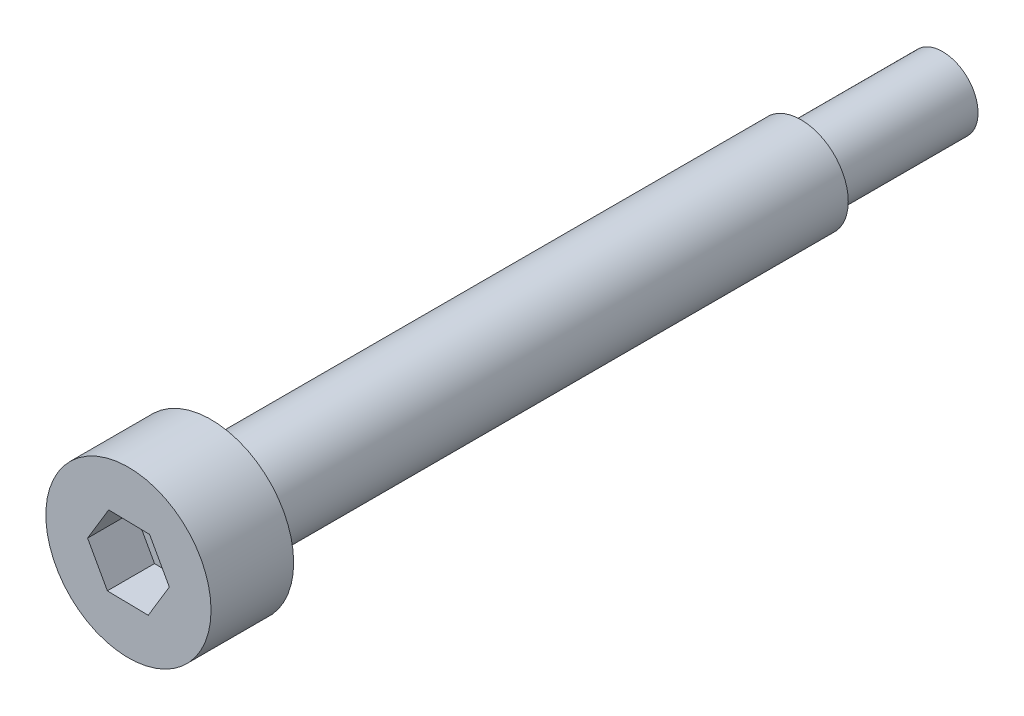
ISO-10303-21;
HEADER;
FILE_DESCRIPTION(('STEP AP214'),'2;1');
FILE_NAME('part.step','',(''),(''),'','','');
FILE_SCHEMA(('AUTOMOTIVE_DESIGN { 1 0 10303 214 1 1 1 1 }'));
ENDSEC;
DATA;
#1=APPLICATION_CONTEXT('core data for automotive mechanical design processes');
#2=APPLICATION_PROTOCOL_DEFINITION('international standard','automotive_design',2000,#1);
#3=PRODUCT_CONTEXT('',#1,'mechanical');
#4=PRODUCT('Part','Part','',(#3));
#5=PRODUCT_RELATED_PRODUCT_CATEGORY('part','',(#4));
#6=PRODUCT_DEFINITION_FORMATION('','',#4);
#7=PRODUCT_DEFINITION_CONTEXT('part definition',#1,'design');
#8=PRODUCT_DEFINITION('design','',#6,#7);
#9=PRODUCT_DEFINITION_SHAPE('','',#8);
#10=(LENGTH_UNIT() NAMED_UNIT(*) SI_UNIT(.MILLI.,.METRE.));
#11=(NAMED_UNIT(*) PLANE_ANGLE_UNIT() SI_UNIT($,.RADIAN.));
#12=(NAMED_UNIT(*) SI_UNIT($,.STERADIAN.) SOLID_ANGLE_UNIT());
#13=UNCERTAINTY_MEASURE_WITH_UNIT(LENGTH_MEASURE(1.E-05),#10,'distance_accuracy_value','');
#14=(GEOMETRIC_REPRESENTATION_CONTEXT(3) GLOBAL_UNCERTAINTY_ASSIGNED_CONTEXT((#13)) GLOBAL_UNIT_ASSIGNED_CONTEXT((#10,
#11,#12)) REPRESENTATION_CONTEXT('',''));
#15=CARTESIAN_POINT('',(0.,0.,0.));
#16=DIRECTION('',(0.,0.,1.));
#17=DIRECTION('',(1.,0.,0.));
#18=AXIS2_PLACEMENT_3D('',#15,#16,#17);
#19=CARTESIAN_POINT('',(0.,0.,3.5));
#20=DIRECTION('',(0.,0.,-1.));
#21=DIRECTION('',(-1.,0.,0.));
#22=AXIS2_PLACEMENT_3D('',#19,#20,#21);
#23=CYLINDRICAL_SURFACE('',#22,3.5);
#24=CARTESIAN_POINT('',(0.,0.,3.5));
#25=DIRECTION('',(0.,0.,1.));
#26=DIRECTION('',(1.,0.,0.));
#27=AXIS2_PLACEMENT_3D('',#24,#25,#26);
#28=CIRCLE('',#27,3.5);
#29=CARTESIAN_POINT('',(3.5,0.,3.5));
#30=VERTEX_POINT('',#29);
#31=EDGE_CURVE('E44',#30,#30,#28,.T.);
#32=ORIENTED_EDGE('',*,*,#31,.F.);
#33=EDGE_LOOP('',(#32));
#34=FACE_BOUND('',#33,.T.);
#35=CARTESIAN_POINT('',(0.,0.,0.));
#36=DIRECTION('',(0.,0.,1.));
#37=DIRECTION('',(1.,0.,0.));
#38=AXIS2_PLACEMENT_3D('',#35,#36,#37);
#39=CIRCLE('',#38,3.5);
#40=CARTESIAN_POINT('',(3.5,0.,0.));
#41=VERTEX_POINT('',#40);
#42=EDGE_CURVE('E139',#41,#41,#39,.T.);
#43=ORIENTED_EDGE('',*,*,#42,.T.);
#44=EDGE_LOOP('',(#43));
#45=FACE_BOUND('',#44,.T.);
#46=ADVANCED_FACE('F37',(#34,#45),#23,.T.);
#47=CARTESIAN_POINT('',(0.,0.,3.5));
#48=DIRECTION('',(0.,0.,1.));
#49=DIRECTION('',(1.,0.,0.));
#50=AXIS2_PLACEMENT_3D('',#47,#48,#49);
#51=PLANE('',#50);
#52=DIRECTION('',(-0.483885708586405,0.875131202178183,0.));
#53=VECTOR('',#52,1.);
#54=CARTESIAN_POINT('',(1.73175411943134,-0.0320572898511147,3.5));
#55=LINE('',#54,#53);
#56=CARTESIAN_POINT('',(1.73175411943134,-0.0320572898511147,3.5));
#57=VERTEX_POINT('',#56);
#58=CARTESIAN_POINT('',(0.893639487103215,1.48371441561033,3.5));
#59=VERTEX_POINT('',#58);
#60=EDGE_CURVE('E51',#57,#59,#55,.T.);
#61=ORIENTED_EDGE('',*,*,#60,.F.);
#62=DIRECTION('',(0.51594299843752,0.856622917253152,0.));
#63=VECTOR('',#62,1.);
#64=CARTESIAN_POINT('',(0.838114632328121,-1.51577170546145,3.5));
#65=LINE('',#64,#63);
#66=CARTESIAN_POINT('',(0.838114632328121,-1.51577170546145,3.5));
#67=VERTEX_POINT('',#66);
#68=EDGE_CURVE('E135',#67,#57,#65,.T.);
#69=ORIENTED_EDGE('',*,*,#68,.F.);
#70=DIRECTION('',(0.999828707023925,-0.0185082849250311,0.));
#71=VECTOR('',#70,1.);
#72=CARTESIAN_POINT('',(-0.893639487103214,-1.48371441561033,3.5));
#73=LINE('',#72,#71);
#74=CARTESIAN_POINT('',(-0.893639487103214,-1.48371441561033,3.5));
#75=VERTEX_POINT('',#74);
#76=EDGE_CURVE('E133',#75,#67,#73,.T.);
#77=ORIENTED_EDGE('',*,*,#76,.F.);
#78=DIRECTION('',(0.483885708586405,-0.875131202178183,0.));
#79=VECTOR('',#78,1.);
#80=CARTESIAN_POINT('',(-1.73175411943134,0.0320572898511147,3.5));
#81=LINE('',#80,#79);
#82=CARTESIAN_POINT('',(-1.73175411943134,0.0320572898511147,3.5));
#83=VERTEX_POINT('',#82);
#84=EDGE_CURVE('E99',#83,#75,#81,.T.);
#85=ORIENTED_EDGE('',*,*,#84,.F.);
#86=DIRECTION('',(-0.51594299843752,-0.856622917253152,0.));
#87=VECTOR('',#86,1.);
#88=CARTESIAN_POINT('',(-0.838114632328121,1.51577170546145,3.5));
#89=LINE('',#88,#87);
#90=CARTESIAN_POINT('',(-0.838114632328121,1.51577170546145,3.5));
#91=VERTEX_POINT('',#90);
#92=EDGE_CURVE('E129',#91,#83,#89,.T.);
#93=ORIENTED_EDGE('',*,*,#92,.F.);
#94=DIRECTION('',(-0.999828707023925,0.0185082849250311,0.));
#95=VECTOR('',#94,1.);
#96=CARTESIAN_POINT('',(0.893639487103215,1.48371441561033,3.5));
#97=LINE('',#96,#95);
#98=EDGE_CURVE('E125',#59,#91,#97,.T.);
#99=ORIENTED_EDGE('',*,*,#98,.F.);
#100=EDGE_LOOP('',(#61,#69,#77,#85,#93,#99));
#101=FACE_BOUND('',#100,.T.);
#102=ORIENTED_EDGE('',*,*,#31,.T.);
#103=EDGE_LOOP('',(#102));
#104=FACE_BOUND('',#103,.T.);
#105=ADVANCED_FACE('F153',(#101,#104),#51,.T.);
#106=CARTESIAN_POINT('',(0.,0.,0.));
#107=DIRECTION('',(0.,0.,1.));
#108=DIRECTION('',(1.,0.,0.));
#109=AXIS2_PLACEMENT_3D('',#106,#107,#108);
#110=PLANE('',#109);
#111=CARTESIAN_POINT('',(0.,0.,0.));
#112=DIRECTION('',(0.,0.,1.));
#113=DIRECTION('',(1.,0.,0.));
#114=AXIS2_PLACEMENT_3D('',#111,#112,#113);
#115=CIRCLE('',#114,2.);
#116=CARTESIAN_POINT('',(2.,0.,0.));
#117=VERTEX_POINT('',#116);
#118=EDGE_CURVE('E11',#117,#117,#115,.F.);
#119=ORIENTED_EDGE('',*,*,#118,.F.);
#120=EDGE_LOOP('',(#119));
#121=FACE_BOUND('',#120,.T.);
#122=ORIENTED_EDGE('',*,*,#42,.F.);
#123=EDGE_LOOP('',(#122));
#124=FACE_BOUND('',#123,.T.);
#125=ADVANCED_FACE('F150',(#121,#124),#110,.F.);
#126=CARTESIAN_POINT('',(1.73175411943134,-0.0320572898511147,1.5));
#127=DIRECTION('',(0.875131202178183,0.483885708586405,0.));
#128=DIRECTION('',(-0.483885708586405,0.875131202178183,0.));
#129=AXIS2_PLACEMENT_3D('',#126,#127,#128);
#130=PLANE('',#129);
#131=ORIENTED_EDGE('',*,*,#60,.T.);
#132=DIRECTION('',(0.,0.,1.));
#133=VECTOR('',#132,1.);
#134=CARTESIAN_POINT('',(0.893639487103215,1.48371441561033,1.5));
#135=LINE('',#134,#133);
#136=CARTESIAN_POINT('',(0.893639487103215,1.48371441561033,1.5));
#137=VERTEX_POINT('',#136);
#138=EDGE_CURVE('E81',#137,#59,#135,.T.);
#139=ORIENTED_EDGE('',*,*,#138,.F.);
#140=DIRECTION('',(-0.483885708586405,0.875131202178183,0.));
#141=VECTOR('',#140,1.);
#142=CARTESIAN_POINT('',(1.73175411943134,-0.0320572898511147,1.5));
#143=LINE('',#142,#141);
#144=CARTESIAN_POINT('',(1.73175411943134,-0.0320572898511147,1.5));
#145=VERTEX_POINT('',#144);
#146=EDGE_CURVE('E137',#145,#137,#143,.T.);
#147=ORIENTED_EDGE('',*,*,#146,.F.);
#148=DIRECTION('',(0.,0.,1.));
#149=VECTOR('',#148,1.);
#150=CARTESIAN_POINT('',(1.73175411943134,-0.0320572898511147,1.5));
#151=LINE('',#150,#149);
#152=EDGE_CURVE('E59',#145,#57,#151,.T.);
#153=ORIENTED_EDGE('',*,*,#152,.T.);
#154=EDGE_LOOP('',(#131,#139,#147,#153));
#155=FACE_BOUND('',#154,.T.);
#156=ADVANCED_FACE('F152',(#155),#130,.F.);
#157=CARTESIAN_POINT('',(0.838114632328121,-1.51577170546145,1.5));
#158=DIRECTION('',(0.856622917253152,-0.51594299843752,0.));
#159=DIRECTION('',(0.51594299843752,0.856622917253153,0.));
#160=AXIS2_PLACEMENT_3D('',#157,#158,#159);
#161=PLANE('',#160);
#162=ORIENTED_EDGE('',*,*,#68,.T.);
#163=ORIENTED_EDGE('',*,*,#152,.F.);
#164=DIRECTION('',(0.51594299843752,0.856622917253152,0.));
#165=VECTOR('',#164,1.);
#166=CARTESIAN_POINT('',(0.838114632328121,-1.51577170546145,1.5));
#167=LINE('',#166,#165);
#168=CARTESIAN_POINT('',(0.838114632328121,-1.51577170546145,1.5));
#169=VERTEX_POINT('',#168);
#170=EDGE_CURVE('E111',#169,#145,#167,.T.);
#171=ORIENTED_EDGE('',*,*,#170,.F.);
#172=DIRECTION('',(0.,0.,1.));
#173=VECTOR('',#172,1.);
#174=CARTESIAN_POINT('',(0.838114632328121,-1.51577170546145,1.5));
#175=LINE('',#174,#173);
#176=EDGE_CURVE('E103',#169,#67,#175,.T.);
#177=ORIENTED_EDGE('',*,*,#176,.T.);
#178=EDGE_LOOP('',(#162,#163,#171,#177));
#179=FACE_BOUND('',#178,.T.);
#180=ADVANCED_FACE('F159',(#179),#161,.F.);
#181=CARTESIAN_POINT('',(-0.893639487103214,-1.48371441561033,1.5));
#182=DIRECTION('',(-0.0185082849250311,-0.999828707023925,0.));
#183=DIRECTION('',(0.999828707023925,-0.0185082849250311,0.));
#184=AXIS2_PLACEMENT_3D('',#181,#182,#183);
#185=PLANE('',#184);
#186=ORIENTED_EDGE('',*,*,#76,.T.);
#187=ORIENTED_EDGE('',*,*,#176,.F.);
#188=DIRECTION('',(0.999828707023925,-0.0185082849250311,0.));
#189=VECTOR('',#188,1.);
#190=CARTESIAN_POINT('',(-0.893639487103214,-1.48371441561033,1.5));
#191=LINE('',#190,#189);
#192=CARTESIAN_POINT('',(-0.893639487103214,-1.48371441561033,1.5));
#193=VERTEX_POINT('',#192);
#194=EDGE_CURVE('E107',#193,#169,#191,.T.);
#195=ORIENTED_EDGE('',*,*,#194,.F.);
#196=DIRECTION('',(0.,0.,1.));
#197=VECTOR('',#196,1.);
#198=CARTESIAN_POINT('',(-0.893639487103214,-1.48371441561033,1.5));
#199=LINE('',#198,#197);
#200=EDGE_CURVE('E92',#193,#75,#199,.T.);
#201=ORIENTED_EDGE('',*,*,#200,.T.);
#202=EDGE_LOOP('',(#186,#187,#195,#201));
#203=FACE_BOUND('',#202,.T.);
#204=ADVANCED_FACE('F108',(#203),#185,.F.);
#205=CARTESIAN_POINT('',(-1.73175411943134,0.0320572898511147,1.5));
#206=DIRECTION('',(-0.875131202178183,-0.483885708586405,0.));
#207=DIRECTION('',(0.483885708586405,-0.875131202178183,0.));
#208=AXIS2_PLACEMENT_3D('',#205,#206,#207);
#209=PLANE('',#208);
#210=ORIENTED_EDGE('',*,*,#84,.T.);
#211=ORIENTED_EDGE('',*,*,#200,.F.);
#212=DIRECTION('',(0.483885708586405,-0.875131202178183,0.));
#213=VECTOR('',#212,1.);
#214=CARTESIAN_POINT('',(-1.73175411943134,0.0320572898511147,1.5));
#215=LINE('',#214,#213);
#216=CARTESIAN_POINT('',(-1.73175411943134,0.0320572898511147,1.5));
#217=VERTEX_POINT('',#216);
#218=EDGE_CURVE('E96',#217,#193,#215,.T.);
#219=ORIENTED_EDGE('',*,*,#218,.F.);
#220=DIRECTION('',(0.,0.,1.));
#221=VECTOR('',#220,1.);
#222=CARTESIAN_POINT('',(-1.73175411943134,0.0320572898511147,1.5));
#223=LINE('',#222,#221);
#224=EDGE_CURVE('E104',#217,#83,#223,.T.);
#225=ORIENTED_EDGE('',*,*,#224,.T.);
#226=EDGE_LOOP('',(#210,#211,#219,#225));
#227=FACE_BOUND('',#226,.T.);
#228=ADVANCED_FACE('F94',(#227),#209,.F.);
#229=CARTESIAN_POINT('',(-0.838114632328121,1.51577170546145,1.5));
#230=DIRECTION('',(-0.856622917253152,0.51594299843752,0.));
#231=DIRECTION('',(-0.51594299843752,-0.856622917253153,0.));
#232=AXIS2_PLACEMENT_3D('',#229,#230,#231);
#233=PLANE('',#232);
#234=ORIENTED_EDGE('',*,*,#92,.T.);
#235=ORIENTED_EDGE('',*,*,#224,.F.);
#236=DIRECTION('',(-0.51594299843752,-0.856622917253152,0.));
#237=VECTOR('',#236,1.);
#238=CARTESIAN_POINT('',(-0.838114632328121,1.51577170546145,1.5));
#239=LINE('',#238,#237);
#240=CARTESIAN_POINT('',(-0.838114632328121,1.51577170546145,1.5));
#241=VERTEX_POINT('',#240);
#242=EDGE_CURVE('E117',#241,#217,#239,.T.);
#243=ORIENTED_EDGE('',*,*,#242,.F.);
#244=DIRECTION('',(0.,0.,1.));
#245=VECTOR('',#244,1.);
#246=CARTESIAN_POINT('',(-0.838114632328121,1.51577170546145,1.5));
#247=LINE('',#246,#245);
#248=EDGE_CURVE('E142',#241,#91,#247,.T.);
#249=ORIENTED_EDGE('',*,*,#248,.T.);
#250=EDGE_LOOP('',(#234,#235,#243,#249));
#251=FACE_BOUND('',#250,.T.);
#252=ADVANCED_FACE('F206',(#251),#233,.F.);
#253=CARTESIAN_POINT('',(0.893639487103215,1.48371441561033,1.5));
#254=DIRECTION('',(0.0185082849250311,0.999828707023925,0.));
#255=DIRECTION('',(-0.999828707023925,0.0185082849250311,0.));
#256=AXIS2_PLACEMENT_3D('',#253,#254,#255);
#257=PLANE('',#256);
#258=ORIENTED_EDGE('',*,*,#98,.T.);
#259=ORIENTED_EDGE('',*,*,#248,.F.);
#260=DIRECTION('',(-0.999828707023925,0.0185082849250311,0.));
#261=VECTOR('',#260,1.);
#262=CARTESIAN_POINT('',(0.893639487103215,1.48371441561033,1.5));
#263=LINE('',#262,#261);
#264=EDGE_CURVE('E119',#137,#241,#263,.T.);
#265=ORIENTED_EDGE('',*,*,#264,.F.);
#266=ORIENTED_EDGE('',*,*,#138,.T.);
#267=EDGE_LOOP('',(#258,#259,#265,#266));
#268=FACE_BOUND('',#267,.T.);
#269=ADVANCED_FACE('F215',(#268),#257,.F.);
#270=CARTESIAN_POINT('',(0.,0.,1.5));
#271=DIRECTION('',(0.,0.,1.));
#272=DIRECTION('',(1.,0.,0.));
#273=AXIS2_PLACEMENT_3D('',#270,#271,#272);
#274=PLANE('',#273);
#275=ORIENTED_EDGE('',*,*,#146,.T.);
#276=ORIENTED_EDGE('',*,*,#264,.T.);
#277=ORIENTED_EDGE('',*,*,#242,.T.);
#278=ORIENTED_EDGE('',*,*,#218,.T.);
#279=ORIENTED_EDGE('',*,*,#194,.T.);
#280=ORIENTED_EDGE('',*,*,#170,.T.);
#281=EDGE_LOOP('',(#275,#276,#277,#278,#279,#280));
#282=FACE_BOUND('',#281,.T.);
#283=ADVANCED_FACE('F114',(#282),#274,.T.);
#284=CARTESIAN_POINT('',(0.,0.,-25.));
#285=DIRECTION('',(0.,0.,1.));
#286=DIRECTION('',(1.,0.,0.));
#287=AXIS2_PLACEMENT_3D('',#284,#285,#286);
#288=CYLINDRICAL_SURFACE('',#287,2.);
#289=CARTESIAN_POINT('',(0.,0.,-25.));
#290=DIRECTION('',(0.,0.,-1.));
#291=DIRECTION('',(-1.,0.,0.));
#292=AXIS2_PLACEMENT_3D('',#289,#290,#291);
#293=CIRCLE('',#292,2.);
#294=CARTESIAN_POINT('',(-2.,0.,-25.));
#295=VERTEX_POINT('',#294);
#296=EDGE_CURVE('E126',#295,#295,#293,.T.);
#297=ORIENTED_EDGE('',*,*,#296,.F.);
#298=EDGE_LOOP('',(#297));
#299=FACE_BOUND('',#298,.T.);
#300=ORIENTED_EDGE('',*,*,#118,.T.);
#301=EDGE_LOOP('',(#300));
#302=FACE_BOUND('',#301,.T.);
#303=ADVANCED_FACE('F233',(#299,#302),#288,.T.);
#304=CARTESIAN_POINT('',(0.,0.,-25.));
#305=DIRECTION('',(0.,0.,-1.));
#306=DIRECTION('',(-1.,0.,0.));
#307=AXIS2_PLACEMENT_3D('',#304,#305,#306);
#308=PLANE('',#307);
#309=CARTESIAN_POINT('',(0.,0.,-25.));
#310=DIRECTION('',(0.,0.,-1.));
#311=DIRECTION('',(-1.,0.,0.));
#312=AXIS2_PLACEMENT_3D('',#309,#310,#311);
#313=CIRCLE('',#312,1.5);
#314=CARTESIAN_POINT('',(-1.5,0.,-25.));
#315=VERTEX_POINT('',#314);
#316=EDGE_CURVE('E285',#315,#315,#313,.T.);
#317=ORIENTED_EDGE('',*,*,#316,.F.);
#318=EDGE_LOOP('',(#317));
#319=FACE_BOUND('',#318,.T.);
#320=ORIENTED_EDGE('',*,*,#296,.T.);
#321=EDGE_LOOP('',(#320));
#322=FACE_BOUND('',#321,.T.);
#323=ADVANCED_FACE('F246',(#319,#322),#308,.T.);
#324=CARTESIAN_POINT('',(0.,0.,-31.));
#325=DIRECTION('',(0.,0.,1.));
#326=DIRECTION('',(1.,0.,0.));
#327=AXIS2_PLACEMENT_3D('',#324,#325,#326);
#328=CYLINDRICAL_SURFACE('',#327,1.5);
#329=CARTESIAN_POINT('',(0.,0.,-31.));
#330=DIRECTION('',(0.,0.,-1.));
#331=DIRECTION('',(-1.,0.,0.));
#332=AXIS2_PLACEMENT_3D('',#329,#330,#331);
#333=CIRCLE('',#332,1.5);
#334=CARTESIAN_POINT('',(-1.5,0.,-31.));
#335=VERTEX_POINT('',#334);
#336=EDGE_CURVE('E284',#335,#335,#333,.T.);
#337=ORIENTED_EDGE('',*,*,#336,.F.);
#338=EDGE_LOOP('',(#337));
#339=FACE_BOUND('',#338,.T.);
#340=ORIENTED_EDGE('',*,*,#316,.T.);
#341=EDGE_LOOP('',(#340));
#342=FACE_BOUND('',#341,.T.);
#343=ADVANCED_FACE('F256',(#339,#342),#328,.T.);
#344=CARTESIAN_POINT('',(0.,0.,-31.));
#345=DIRECTION('',(0.,0.,-1.));
#346=DIRECTION('',(-1.,0.,0.));
#347=AXIS2_PLACEMENT_3D('',#344,#345,#346);
#348=PLANE('',#347);
#349=ORIENTED_EDGE('',*,*,#336,.T.);
#350=EDGE_LOOP('',(#349));
#351=FACE_BOUND('',#350,.T.);
#352=ADVANCED_FACE('F267',(#351),#348,.T.);
#353=CLOSED_SHELL('',(#46,#105,#125,#156,#180,#204,#228,#252,#269,#283,#303,#323,#343,#352));
#354=MANIFOLD_SOLID_BREP('B2',#353);
#355=ADVANCED_BREP_SHAPE_REPRESENTATION('',(#18,#354),#14);
#356=SHAPE_DEFINITION_REPRESENTATION(#9,#355);
ENDSEC;
END-ISO-10303-21;
